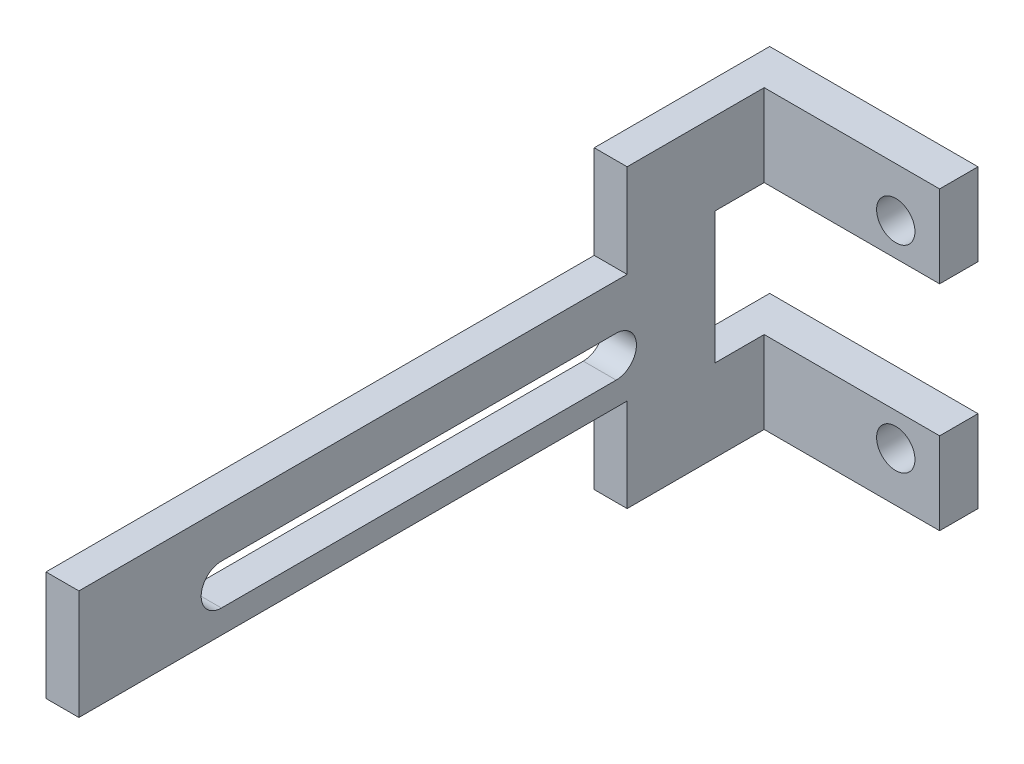
ISO-10303-21;
HEADER;
FILE_DESCRIPTION(('STEP AP214'),'2;1');
FILE_NAME('part.step','',(''),(''),'','','');
FILE_SCHEMA(('AUTOMOTIVE_DESIGN { 1 0 10303 214 1 1 1 1 }'));
ENDSEC;
DATA;
#1=APPLICATION_CONTEXT('core data for automotive mechanical design processes');
#2=APPLICATION_PROTOCOL_DEFINITION('international standard','automotive_design',2000,#1);
#3=PRODUCT_CONTEXT('',#1,'mechanical');
#4=PRODUCT('Part','Part','',(#3));
#5=PRODUCT_RELATED_PRODUCT_CATEGORY('part','',(#4));
#6=PRODUCT_DEFINITION_FORMATION('','',#4);
#7=PRODUCT_DEFINITION_CONTEXT('part definition',#1,'design');
#8=PRODUCT_DEFINITION('design','',#6,#7);
#9=PRODUCT_DEFINITION_SHAPE('','',#8);
#10=(LENGTH_UNIT() NAMED_UNIT(*) SI_UNIT(.MILLI.,.METRE.));
#11=(NAMED_UNIT(*) PLANE_ANGLE_UNIT() SI_UNIT($,.RADIAN.));
#12=(NAMED_UNIT(*) SI_UNIT($,.STERADIAN.) SOLID_ANGLE_UNIT());
#13=UNCERTAINTY_MEASURE_WITH_UNIT(LENGTH_MEASURE(1.E-05),#10,'distance_accuracy_value','');
#14=(GEOMETRIC_REPRESENTATION_CONTEXT(3) GLOBAL_UNCERTAINTY_ASSIGNED_CONTEXT((#13)) GLOBAL_UNIT_ASSIGNED_CONTEXT((#10,
#11,#12)) REPRESENTATION_CONTEXT('',''));
#15=CARTESIAN_POINT('',(0.,0.,0.));
#16=DIRECTION('',(0.,0.,1.));
#17=DIRECTION('',(1.,0.,0.));
#18=AXIS2_PLACEMENT_3D('',#15,#16,#17);
#19=CARTESIAN_POINT('',(3.,-13.5,0.));
#20=DIRECTION('',(0.,0.,1.));
#21=DIRECTION('',(1.,0.,0.));
#22=AXIS2_PLACEMENT_3D('',#19,#20,#21);
#23=PLANE('',#22);
#24=CARTESIAN_POINT('',(15.,-9.,0.));
#25=DIRECTION('',(0.,0.,1.));
#26=DIRECTION('',(1.,0.,0.));
#27=AXIS2_PLACEMENT_3D('',#24,#25,#26);
#28=CIRCLE('',#27,1.75);
#29=CARTESIAN_POINT('',(16.75,-9.,0.));
#30=VERTEX_POINT('',#29);
#31=EDGE_CURVE('E441',#30,#30,#28,.T.);
#32=ORIENTED_EDGE('',*,*,#31,.T.);
#33=EDGE_LOOP('',(#32));
#34=FACE_BOUND('',#33,.T.);
#35=DIRECTION('',(0.,1.,0.));
#36=VECTOR('',#35,1.);
#37=CARTESIAN_POINT('',(0.,-13.5,0.));
#38=LINE('',#37,#36);
#39=CARTESIAN_POINT('',(0.,-13.5,0.));
#40=VERTEX_POINT('',#39);
#41=CARTESIAN_POINT('',(0.,-6.,0.));
#42=VERTEX_POINT('',#41);
#43=EDGE_CURVE('E202',#40,#42,#38,.T.);
#44=ORIENTED_EDGE('',*,*,#43,.T.);
#45=DIRECTION('',(1.,0.,0.));
#46=VECTOR('',#45,1.);
#47=CARTESIAN_POINT('',(-2.00000000000001,-6.,0.));
#48=LINE('',#47,#46);
#49=CARTESIAN_POINT('',(19.,-6.,0.));
#50=VERTEX_POINT('',#49);
#51=EDGE_CURVE('E186',#42,#50,#48,.T.);
#52=ORIENTED_EDGE('',*,*,#51,.T.);
#53=DIRECTION('',(0.,1.,0.));
#54=VECTOR('',#53,1.);
#55=CARTESIAN_POINT('',(19.,-13.5,0.));
#56=LINE('',#55,#54);
#57=CARTESIAN_POINT('',(19.,-13.5,0.));
#58=VERTEX_POINT('',#57);
#59=EDGE_CURVE('E199',#58,#50,#56,.T.);
#60=ORIENTED_EDGE('',*,*,#59,.F.);
#61=DIRECTION('',(-1.,0.,0.));
#62=VECTOR('',#61,1.);
#63=CARTESIAN_POINT('',(3.,-13.5,0.));
#64=LINE('',#63,#62);
#65=EDGE_CURVE('E339',#58,#40,#64,.T.);
#66=ORIENTED_EDGE('',*,*,#65,.T.);
#67=EDGE_LOOP('',(#44,#52,#60,#66));
#68=FACE_BOUND('',#67,.T.);
#69=ADVANCED_FACE('F45',(#34,#68),#23,.F.);
#70=CARTESIAN_POINT('',(19.,-13.5,3.5));
#71=DIRECTION('',(0.,0.,-1.));
#72=DIRECTION('',(0.,1.,0.));
#73=AXIS2_PLACEMENT_3D('',#70,#71,#72);
#74=PLANE('',#73);
#75=CARTESIAN_POINT('',(15.,-9.,3.5));
#76=DIRECTION('',(0.,0.,1.));
#77=DIRECTION('',(1.,0.,0.));
#78=AXIS2_PLACEMENT_3D('',#75,#76,#77);
#79=CIRCLE('',#78,1.75);
#80=CARTESIAN_POINT('',(16.75,-9.,3.5));
#81=VERTEX_POINT('',#80);
#82=EDGE_CURVE('E450',#81,#81,#79,.T.);
#83=ORIENTED_EDGE('',*,*,#82,.F.);
#84=EDGE_LOOP('',(#83));
#85=FACE_BOUND('',#84,.T.);
#86=DIRECTION('',(0.,-1.,0.));
#87=VECTOR('',#86,1.);
#88=CARTESIAN_POINT('',(19.,-13.5,3.5));
#89=LINE('',#88,#87);
#90=CARTESIAN_POINT('',(19.,-6.,3.5));
#91=VERTEX_POINT('',#90);
#92=CARTESIAN_POINT('',(19.,-13.5,3.5));
#93=VERTEX_POINT('',#92);
#94=EDGE_CURVE('E216',#91,#93,#89,.T.);
#95=ORIENTED_EDGE('',*,*,#94,.F.);
#96=DIRECTION('',(-1.,0.,0.));
#97=VECTOR('',#96,1.);
#98=CARTESIAN_POINT('',(19.,-6.,3.5));
#99=LINE('',#98,#97);
#100=CARTESIAN_POINT('',(3.,-6.,3.5));
#101=VERTEX_POINT('',#100);
#102=EDGE_CURVE('E189',#91,#101,#99,.T.);
#103=ORIENTED_EDGE('',*,*,#102,.T.);
#104=DIRECTION('',(0.,-1.,0.));
#105=VECTOR('',#104,1.);
#106=CARTESIAN_POINT('',(3.,-13.5,3.5));
#107=LINE('',#106,#105);
#108=CARTESIAN_POINT('',(3.,-13.5,3.5));
#109=VERTEX_POINT('',#108);
#110=EDGE_CURVE('E228',#101,#109,#107,.T.);
#111=ORIENTED_EDGE('',*,*,#110,.T.);
#112=DIRECTION('',(-1.,0.,0.));
#113=VECTOR('',#112,1.);
#114=CARTESIAN_POINT('',(19.,-13.5,3.5));
#115=LINE('',#114,#113);
#116=EDGE_CURVE('E225',#93,#109,#115,.T.);
#117=ORIENTED_EDGE('',*,*,#116,.F.);
#118=EDGE_LOOP('',(#95,#103,#111,#117));
#119=FACE_BOUND('',#118,.T.);
#120=ADVANCED_FACE('F427',(#85,#119),#74,.F.);
#121=CARTESIAN_POINT('',(19.,0.,0.));
#122=DIRECTION('',(1.,0.,0.));
#123=DIRECTION('',(0.,0.,-1.));
#124=AXIS2_PLACEMENT_3D('',#121,#122,#123);
#125=PLANE('',#124);
#126=DIRECTION('',(0.,0.,-1.));
#127=VECTOR('',#126,1.);
#128=CARTESIAN_POINT('',(19.,-6.,0.));
#129=LINE('',#128,#127);
#130=EDGE_CURVE('E54',#91,#50,#129,.T.);
#131=ORIENTED_EDGE('',*,*,#130,.F.);
#132=ORIENTED_EDGE('',*,*,#94,.T.);
#133=DIRECTION('',(0.,0.,-1.));
#134=VECTOR('',#133,1.);
#135=CARTESIAN_POINT('',(19.,-13.5,3.5));
#136=LINE('',#135,#134);
#137=EDGE_CURVE('E208',#93,#58,#136,.T.);
#138=ORIENTED_EDGE('',*,*,#137,.T.);
#139=ORIENTED_EDGE('',*,*,#59,.T.);
#140=EDGE_LOOP('',(#131,#132,#138,#139));
#141=FACE_BOUND('',#140,.T.);
#142=ADVANCED_FACE('F206',(#141),#125,.T.);
#143=CARTESIAN_POINT('',(3.,0.,0.));
#144=DIRECTION('',(1.,0.,0.));
#145=DIRECTION('',(0.,0.,-1.));
#146=AXIS2_PLACEMENT_3D('',#143,#144,#145);
#147=PLANE('',#146);
#148=DIRECTION('',(0.,0.,-1.));
#149=VECTOR('',#148,1.);
#150=CARTESIAN_POINT('',(3.,-6.,0.));
#151=LINE('',#150,#149);
#152=CARTESIAN_POINT('',(3.,-6.,8.));
#153=VERTEX_POINT('',#152);
#154=EDGE_CURVE('E463',#153,#101,#151,.T.);
#155=ORIENTED_EDGE('',*,*,#154,.F.);
#156=DIRECTION('',(0.,-1.,0.));
#157=VECTOR('',#156,1.);
#158=CARTESIAN_POINT('',(3.,0.,8.));
#159=LINE('',#158,#157);
#160=CARTESIAN_POINT('',(3.,6.,8.));
#161=VERTEX_POINT('',#160);
#162=EDGE_CURVE('E455',#161,#153,#159,.T.);
#163=ORIENTED_EDGE('',*,*,#162,.F.);
#164=DIRECTION('',(0.,0.,1.));
#165=VECTOR('',#164,1.);
#166=CARTESIAN_POINT('',(3.,6.,0.));
#167=LINE('',#166,#165);
#168=CARTESIAN_POINT('',(3.,6.,3.5));
#169=VERTEX_POINT('',#168);
#170=EDGE_CURVE('E473',#169,#161,#167,.T.);
#171=ORIENTED_EDGE('',*,*,#170,.F.);
#172=CARTESIAN_POINT('',(3.,13.5,3.5));
#173=VERTEX_POINT('',#172);
#174=EDGE_CURVE('E69',#173,#169,#107,.T.);
#175=ORIENTED_EDGE('',*,*,#174,.F.);
#176=DIRECTION('',(0.,0.,1.));
#177=VECTOR('',#176,1.);
#178=CARTESIAN_POINT('',(3.,13.5,16.));
#179=LINE('',#178,#177);
#180=CARTESIAN_POINT('',(3.,13.5,16.));
#181=VERTEX_POINT('',#180);
#182=EDGE_CURVE('E298',#173,#181,#179,.T.);
#183=ORIENTED_EDGE('',*,*,#182,.T.);
#184=DIRECTION('',(0.,-1.,0.));
#185=VECTOR('',#184,1.);
#186=CARTESIAN_POINT('',(3.,5.,16.));
#187=LINE('',#186,#185);
#188=CARTESIAN_POINT('',(3.,5.,16.));
#189=VERTEX_POINT('',#188);
#190=EDGE_CURVE('E301',#181,#189,#187,.T.);
#191=ORIENTED_EDGE('',*,*,#190,.T.);
#192=DIRECTION('',(0.,0.,1.));
#193=VECTOR('',#192,1.);
#194=CARTESIAN_POINT('',(3.,4.99999999999999,66.));
#195=LINE('',#194,#193);
#196=CARTESIAN_POINT('',(3.,4.99999999999999,66.));
#197=VERTEX_POINT('',#196);
#198=EDGE_CURVE('E280',#189,#197,#195,.T.);
#199=ORIENTED_EDGE('',*,*,#198,.T.);
#200=DIRECTION('',(0.,-1.,0.));
#201=VECTOR('',#200,1.);
#202=CARTESIAN_POINT('',(3.,-5.,66.));
#203=LINE('',#202,#201);
#204=CARTESIAN_POINT('',(3.,-5.,66.));
#205=VERTEX_POINT('',#204);
#206=EDGE_CURVE('E284',#197,#205,#203,.T.);
#207=ORIENTED_EDGE('',*,*,#206,.T.);
#208=DIRECTION('',(0.,0.,-1.));
#209=VECTOR('',#208,1.);
#210=CARTESIAN_POINT('',(3.,-5.,66.));
#211=LINE('',#210,#209);
#212=CARTESIAN_POINT('',(3.,-5.,16.));
#213=VERTEX_POINT('',#212);
#214=EDGE_CURVE('E288',#205,#213,#211,.T.);
#215=ORIENTED_EDGE('',*,*,#214,.T.);
#216=DIRECTION('',(0.,-1.,0.));
#217=VECTOR('',#216,1.);
#218=CARTESIAN_POINT('',(3.,-13.5,16.));
#219=LINE('',#218,#217);
#220=CARTESIAN_POINT('',(3.,-13.5,16.));
#221=VERTEX_POINT('',#220);
#222=EDGE_CURVE('E291',#213,#221,#219,.T.);
#223=ORIENTED_EDGE('',*,*,#222,.T.);
#224=DIRECTION('',(0.,0.,-1.));
#225=VECTOR('',#224,1.);
#226=CARTESIAN_POINT('',(3.,-13.5,16.));
#227=LINE('',#226,#225);
#228=EDGE_CURVE('E294',#221,#109,#227,.T.);
#229=ORIENTED_EDGE('',*,*,#228,.T.);
#230=ORIENTED_EDGE('',*,*,#110,.F.);
#231=EDGE_LOOP('',(#155,#163,#171,#175,#183,#191,#199,#207,#215,#223,#229,#230));
#232=FACE_BOUND('',#231,.T.);
#233=DIRECTION('',(0.,0.,-1.));
#234=VECTOR('',#233,1.);
#235=CARTESIAN_POINT('',(3.,-2.85000000000001,53.));
#236=LINE('',#235,#234);
#237=CARTESIAN_POINT('',(3.,-2.85000000000001,53.));
#238=VERTEX_POINT('',#237);
#239=CARTESIAN_POINT('',(3.,-2.85,17.));
#240=VERTEX_POINT('',#239);
#241=EDGE_CURVE('E240',#238,#240,#236,.T.);
#242=ORIENTED_EDGE('',*,*,#241,.F.);
#243=CARTESIAN_POINT('',(3.,-1.00000000000001,53.));
#244=DIRECTION('',(1.,0.,0.));
#245=DIRECTION('',(0.,0.,-1.));
#246=AXIS2_PLACEMENT_3D('',#243,#244,#245);
#247=CIRCLE('',#246,1.85);
#248=CARTESIAN_POINT('',(3.,0.849999999999994,53.));
#249=VERTEX_POINT('',#248);
#250=EDGE_CURVE('E237',#249,#238,#247,.T.);
#251=ORIENTED_EDGE('',*,*,#250,.F.);
#252=DIRECTION('',(0.,0.,1.));
#253=VECTOR('',#252,1.);
#254=CARTESIAN_POINT('',(3.,0.849999999999994,53.));
#255=LINE('',#254,#253);
#256=CARTESIAN_POINT('',(3.,0.849999999999998,17.));
#257=VERTEX_POINT('',#256);
#258=EDGE_CURVE('E248',#257,#249,#255,.T.);
#259=ORIENTED_EDGE('',*,*,#258,.F.);
#260=CARTESIAN_POINT('',(3.,-1.,17.));
#261=DIRECTION('',(1.,0.,0.));
#262=DIRECTION('',(0.,0.,-1.));
#263=AXIS2_PLACEMENT_3D('',#260,#261,#262);
#264=CIRCLE('',#263,1.85);
#265=EDGE_CURVE('E244',#240,#257,#264,.T.);
#266=ORIENTED_EDGE('',*,*,#265,.F.);
#267=EDGE_LOOP('',(#242,#251,#259,#266));
#268=FACE_BOUND('',#267,.T.);
#269=ADVANCED_FACE('F383',(#232,#268),#147,.T.);
#270=CARTESIAN_POINT('',(0.,0.,0.));
#271=DIRECTION('',(1.,0.,0.));
#272=DIRECTION('',(0.,0.,-1.));
#273=AXIS2_PLACEMENT_3D('',#270,#271,#272);
#274=PLANE('',#273);
#275=DIRECTION('',(0.,-1.,0.));
#276=VECTOR('',#275,1.);
#277=CARTESIAN_POINT('',(0.,0.,8.));
#278=LINE('',#277,#276);
#279=CARTESIAN_POINT('',(0.,6.,8.));
#280=VERTEX_POINT('',#279);
#281=CARTESIAN_POINT('',(0.,-6.,8.));
#282=VERTEX_POINT('',#281);
#283=EDGE_CURVE('E11',#280,#282,#278,.T.);
#284=ORIENTED_EDGE('',*,*,#283,.T.);
#285=DIRECTION('',(0.,0.,-1.));
#286=VECTOR('',#285,1.);
#287=CARTESIAN_POINT('',(0.,-6.,0.));
#288=LINE('',#287,#286);
#289=EDGE_CURVE('E459',#282,#42,#288,.T.);
#290=ORIENTED_EDGE('',*,*,#289,.T.);
#291=ORIENTED_EDGE('',*,*,#43,.F.);
#292=DIRECTION('',(0.,0.,-1.));
#293=VECTOR('',#292,1.);
#294=CARTESIAN_POINT('',(0.,-13.5,16.));
#295=LINE('',#294,#293);
#296=CARTESIAN_POINT('',(0.,-13.5,16.));
#297=VERTEX_POINT('',#296);
#298=EDGE_CURVE('E317',#297,#40,#295,.T.);
#299=ORIENTED_EDGE('',*,*,#298,.F.);
#300=DIRECTION('',(0.,-1.,0.));
#301=VECTOR('',#300,1.);
#302=CARTESIAN_POINT('',(0.,-13.5,16.));
#303=LINE('',#302,#301);
#304=CARTESIAN_POINT('',(0.,-5.,16.));
#305=VERTEX_POINT('',#304);
#306=EDGE_CURVE('E314',#305,#297,#303,.T.);
#307=ORIENTED_EDGE('',*,*,#306,.F.);
#308=DIRECTION('',(0.,0.,-1.));
#309=VECTOR('',#308,1.);
#310=CARTESIAN_POINT('',(0.,-5.,66.));
#311=LINE('',#310,#309);
#312=CARTESIAN_POINT('',(0.,-5.,66.));
#313=VERTEX_POINT('',#312);
#314=EDGE_CURVE('E311',#313,#305,#311,.T.);
#315=ORIENTED_EDGE('',*,*,#314,.F.);
#316=DIRECTION('',(0.,-1.,0.));
#317=VECTOR('',#316,1.);
#318=CARTESIAN_POINT('',(0.,-5.,66.));
#319=LINE('',#318,#317);
#320=CARTESIAN_POINT('',(0.,4.99999999999999,66.));
#321=VERTEX_POINT('',#320);
#322=EDGE_CURVE('E308',#321,#313,#319,.T.);
#323=ORIENTED_EDGE('',*,*,#322,.F.);
#324=DIRECTION('',(0.,0.,1.));
#325=VECTOR('',#324,1.);
#326=CARTESIAN_POINT('',(0.,4.99999999999999,66.));
#327=LINE('',#326,#325);
#328=CARTESIAN_POINT('',(0.,5.,16.));
#329=VERTEX_POINT('',#328);
#330=EDGE_CURVE('E279',#329,#321,#327,.T.);
#331=ORIENTED_EDGE('',*,*,#330,.F.);
#332=DIRECTION('',(0.,-1.,0.));
#333=VECTOR('',#332,1.);
#334=CARTESIAN_POINT('',(0.,5.,16.));
#335=LINE('',#334,#333);
#336=CARTESIAN_POINT('',(0.,13.5,16.));
#337=VERTEX_POINT('',#336);
#338=EDGE_CURVE('E285',#337,#329,#335,.T.);
#339=ORIENTED_EDGE('',*,*,#338,.F.);
#340=DIRECTION('',(0.,0.,1.));
#341=VECTOR('',#340,1.);
#342=CARTESIAN_POINT('',(0.,13.5,16.));
#343=LINE('',#342,#341);
#344=CARTESIAN_POINT('',(0.,13.5,0.));
#345=VERTEX_POINT('',#344);
#346=EDGE_CURVE('E323',#345,#337,#343,.T.);
#347=ORIENTED_EDGE('',*,*,#346,.F.);
#348=CARTESIAN_POINT('',(0.,6.,0.));
#349=VERTEX_POINT('',#348);
#350=EDGE_CURVE('E320',#349,#345,#38,.T.);
#351=ORIENTED_EDGE('',*,*,#350,.F.);
#352=DIRECTION('',(0.,0.,1.));
#353=VECTOR('',#352,1.);
#354=CARTESIAN_POINT('',(0.,6.,0.));
#355=LINE('',#354,#353);
#356=EDGE_CURVE('E397',#349,#280,#355,.T.);
#357=ORIENTED_EDGE('',*,*,#356,.T.);
#358=EDGE_LOOP('',(#284,#290,#291,#299,#307,#315,#323,#331,#339,#347,#351,#357));
#359=FACE_BOUND('',#358,.T.);
#360=CARTESIAN_POINT('',(0.,-1.00000000000001,53.));
#361=DIRECTION('',(1.,0.,0.));
#362=DIRECTION('',(0.,0.,-1.));
#363=AXIS2_PLACEMENT_3D('',#360,#361,#362);
#364=CIRCLE('',#363,1.85);
#365=CARTESIAN_POINT('',(0.,0.849999999999994,53.));
#366=VERTEX_POINT('',#365);
#367=CARTESIAN_POINT('',(0.,-2.85000000000001,53.));
#368=VERTEX_POINT('',#367);
#369=EDGE_CURVE('E236',#366,#368,#364,.T.);
#370=ORIENTED_EDGE('',*,*,#369,.T.);
#371=DIRECTION('',(0.,0.,-1.));
#372=VECTOR('',#371,1.);
#373=CARTESIAN_POINT('',(0.,-2.85000000000001,53.));
#374=LINE('',#373,#372);
#375=CARTESIAN_POINT('',(0.,-2.85,17.));
#376=VERTEX_POINT('',#375);
#377=EDGE_CURVE('E255',#368,#376,#374,.T.);
#378=ORIENTED_EDGE('',*,*,#377,.T.);
#379=CARTESIAN_POINT('',(0.,-1.,17.));
#380=DIRECTION('',(1.,0.,0.));
#381=DIRECTION('',(0.,0.,-1.));
#382=AXIS2_PLACEMENT_3D('',#379,#380,#381);
#383=CIRCLE('',#382,1.85);
#384=CARTESIAN_POINT('',(0.,0.849999999999998,17.));
#385=VERTEX_POINT('',#384);
#386=EDGE_CURVE('E259',#376,#385,#383,.T.);
#387=ORIENTED_EDGE('',*,*,#386,.T.);
#388=DIRECTION('',(0.,0.,1.));
#389=VECTOR('',#388,1.);
#390=CARTESIAN_POINT('',(0.,0.849999999999994,53.));
#391=LINE('',#390,#389);
#392=EDGE_CURVE('E241',#385,#366,#391,.T.);
#393=ORIENTED_EDGE('',*,*,#392,.T.);
#394=EDGE_LOOP('',(#370,#378,#387,#393));
#395=FACE_BOUND('',#394,.T.);
#396=ADVANCED_FACE('F367',(#359,#395),#274,.F.);
#397=CARTESIAN_POINT('',(3.,4.99999999999999,66.));
#398=DIRECTION('',(0.,-1.,0.));
#399=DIRECTION('',(0.,0.,-1.));
#400=AXIS2_PLACEMENT_3D('',#397,#398,#399);
#401=PLANE('',#400);
#402=ORIENTED_EDGE('',*,*,#330,.T.);
#403=DIRECTION('',(-1.,0.,0.));
#404=VECTOR('',#403,1.);
#405=CARTESIAN_POINT('',(3.,4.99999999999999,66.));
#406=LINE('',#405,#404);
#407=EDGE_CURVE('E194',#197,#321,#406,.T.);
#408=ORIENTED_EDGE('',*,*,#407,.F.);
#409=ORIENTED_EDGE('',*,*,#198,.F.);
#410=DIRECTION('',(-1.,0.,0.));
#411=VECTOR('',#410,1.);
#412=CARTESIAN_POINT('',(3.,5.,16.));
#413=LINE('',#412,#411);
#414=EDGE_CURVE('E304',#189,#329,#413,.T.);
#415=ORIENTED_EDGE('',*,*,#414,.T.);
#416=EDGE_LOOP('',(#402,#408,#409,#415));
#417=FACE_BOUND('',#416,.T.);
#418=ADVANCED_FACE('F47',(#417),#401,.F.);
#419=CARTESIAN_POINT('',(3.,-5.,66.));
#420=DIRECTION('',(0.,0.,-1.));
#421=DIRECTION('',(-1.,0.,0.));
#422=AXIS2_PLACEMENT_3D('',#419,#420,#421);
#423=PLANE('',#422);
#424=ORIENTED_EDGE('',*,*,#322,.T.);
#425=DIRECTION('',(-1.,0.,0.));
#426=VECTOR('',#425,1.);
#427=CARTESIAN_POINT('',(3.,-5.,66.));
#428=LINE('',#427,#426);
#429=EDGE_CURVE('E350',#205,#313,#428,.T.);
#430=ORIENTED_EDGE('',*,*,#429,.F.);
#431=ORIENTED_EDGE('',*,*,#206,.F.);
#432=ORIENTED_EDGE('',*,*,#407,.T.);
#433=EDGE_LOOP('',(#424,#430,#431,#432));
#434=FACE_BOUND('',#433,.T.);
#435=ADVANCED_FACE('F359',(#434),#423,.F.);
#436=CARTESIAN_POINT('',(3.,-5.,66.));
#437=DIRECTION('',(0.,1.,0.));
#438=DIRECTION('',(0.,0.,1.));
#439=AXIS2_PLACEMENT_3D('',#436,#437,#438);
#440=PLANE('',#439);
#441=ORIENTED_EDGE('',*,*,#314,.T.);
#442=DIRECTION('',(-1.,0.,0.));
#443=VECTOR('',#442,1.);
#444=CARTESIAN_POINT('',(3.,-5.,16.));
#445=LINE('',#444,#443);
#446=EDGE_CURVE('E346',#213,#305,#445,.T.);
#447=ORIENTED_EDGE('',*,*,#446,.F.);
#448=ORIENTED_EDGE('',*,*,#214,.F.);
#449=ORIENTED_EDGE('',*,*,#429,.T.);
#450=EDGE_LOOP('',(#441,#447,#448,#449));
#451=FACE_BOUND('',#450,.T.);
#452=ADVANCED_FACE('F375',(#451),#440,.F.);
#453=CARTESIAN_POINT('',(3.,-13.5,16.));
#454=DIRECTION('',(0.,0.,-1.));
#455=DIRECTION('',(-1.,0.,0.));
#456=AXIS2_PLACEMENT_3D('',#453,#454,#455);
#457=PLANE('',#456);
#458=ORIENTED_EDGE('',*,*,#306,.T.);
#459=DIRECTION('',(-1.,0.,0.));
#460=VECTOR('',#459,1.);
#461=CARTESIAN_POINT('',(3.,-13.5,16.));
#462=LINE('',#461,#460);
#463=EDGE_CURVE('E342',#221,#297,#462,.T.);
#464=ORIENTED_EDGE('',*,*,#463,.F.);
#465=ORIENTED_EDGE('',*,*,#222,.F.);
#466=ORIENTED_EDGE('',*,*,#446,.T.);
#467=EDGE_LOOP('',(#458,#464,#465,#466));
#468=FACE_BOUND('',#467,.T.);
#469=ADVANCED_FACE('F379',(#468),#457,.F.);
#470=CARTESIAN_POINT('',(3.,-13.5,16.));
#471=DIRECTION('',(0.,1.,0.));
#472=DIRECTION('',(0.,0.,1.));
#473=AXIS2_PLACEMENT_3D('',#470,#471,#472);
#474=PLANE('',#473);
#475=ORIENTED_EDGE('',*,*,#298,.T.);
#476=ORIENTED_EDGE('',*,*,#65,.F.);
#477=ORIENTED_EDGE('',*,*,#137,.F.);
#478=ORIENTED_EDGE('',*,*,#116,.T.);
#479=ORIENTED_EDGE('',*,*,#228,.F.);
#480=ORIENTED_EDGE('',*,*,#463,.T.);
#481=EDGE_LOOP('',(#475,#476,#477,#478,#479,#480));
#482=FACE_BOUND('',#481,.T.);
#483=ADVANCED_FACE('F429',(#482),#474,.F.);
#484=CARTESIAN_POINT('',(15.,9.,0.));
#485=DIRECTION('',(0.,0.,1.));
#486=DIRECTION('',(1.,0.,0.));
#487=AXIS2_PLACEMENT_3D('',#484,#485,#486);
#488=CIRCLE('',#487,1.75);
#489=CARTESIAN_POINT('',(16.75,9.,0.));
#490=VERTEX_POINT('',#489);
#491=EDGE_CURVE('E437',#490,#490,#488,.T.);
#492=ORIENTED_EDGE('',*,*,#491,.T.);
#493=EDGE_LOOP('',(#492));
#494=FACE_BOUND('',#493,.T.);
#495=CARTESIAN_POINT('',(19.,6.,0.));
#496=VERTEX_POINT('',#495);
#497=CARTESIAN_POINT('',(19.,13.5,0.));
#498=VERTEX_POINT('',#497);
#499=EDGE_CURVE('E211',#496,#498,#56,.T.);
#500=ORIENTED_EDGE('',*,*,#499,.F.);
#501=DIRECTION('',(1.,0.,0.));
#502=VECTOR('',#501,1.);
#503=CARTESIAN_POINT('',(-2.00000000000001,6.,0.));
#504=LINE('',#503,#502);
#505=EDGE_CURVE('E61',#349,#496,#504,.T.);
#506=ORIENTED_EDGE('',*,*,#505,.F.);
#507=ORIENTED_EDGE('',*,*,#350,.T.);
#508=DIRECTION('',(-1.,0.,0.));
#509=VECTOR('',#508,1.);
#510=CARTESIAN_POINT('',(3.,13.5,0.));
#511=LINE('',#510,#509);
#512=EDGE_CURVE('E335',#498,#345,#511,.T.);
#513=ORIENTED_EDGE('',*,*,#512,.F.);
#514=EDGE_LOOP('',(#500,#506,#507,#513));
#515=FACE_BOUND('',#514,.T.);
#516=ADVANCED_FACE('F505',(#494,#515),#23,.F.);
#517=CARTESIAN_POINT('',(3.,13.5,16.));
#518=DIRECTION('',(0.,-1.,0.));
#519=DIRECTION('',(0.,0.,-1.));
#520=AXIS2_PLACEMENT_3D('',#517,#518,#519);
#521=PLANE('',#520);
#522=ORIENTED_EDGE('',*,*,#346,.T.);
#523=DIRECTION('',(-1.,0.,0.));
#524=VECTOR('',#523,1.);
#525=CARTESIAN_POINT('',(3.,13.5,16.));
#526=LINE('',#525,#524);
#527=EDGE_CURVE('E331',#181,#337,#526,.T.);
#528=ORIENTED_EDGE('',*,*,#527,.F.);
#529=ORIENTED_EDGE('',*,*,#182,.F.);
#530=DIRECTION('',(-1.,0.,0.));
#531=VECTOR('',#530,1.);
#532=CARTESIAN_POINT('',(19.,13.5,3.5));
#533=LINE('',#532,#531);
#534=CARTESIAN_POINT('',(19.,13.5,3.5));
#535=VERTEX_POINT('',#534);
#536=EDGE_CURVE('E232',#535,#173,#533,.T.);
#537=ORIENTED_EDGE('',*,*,#536,.F.);
#538=DIRECTION('',(0.,0.,1.));
#539=VECTOR('',#538,1.);
#540=CARTESIAN_POINT('',(19.,13.5,3.5));
#541=LINE('',#540,#539);
#542=EDGE_CURVE('E210',#498,#535,#541,.T.);
#543=ORIENTED_EDGE('',*,*,#542,.F.);
#544=ORIENTED_EDGE('',*,*,#512,.T.);
#545=EDGE_LOOP('',(#522,#528,#529,#537,#543,#544));
#546=FACE_BOUND('',#545,.T.);
#547=ADVANCED_FACE('F391',(#546),#521,.F.);
#548=CARTESIAN_POINT('',(3.,5.,16.));
#549=DIRECTION('',(0.,0.,-1.));
#550=DIRECTION('',(-1.,0.,0.));
#551=AXIS2_PLACEMENT_3D('',#548,#549,#550);
#552=PLANE('',#551);
#553=ORIENTED_EDGE('',*,*,#338,.T.);
#554=ORIENTED_EDGE('',*,*,#414,.F.);
#555=ORIENTED_EDGE('',*,*,#190,.F.);
#556=ORIENTED_EDGE('',*,*,#527,.T.);
#557=EDGE_LOOP('',(#553,#554,#555,#556));
#558=FACE_BOUND('',#557,.T.);
#559=ADVANCED_FACE('F389',(#558),#552,.F.);
#560=CARTESIAN_POINT('',(3.,-1.00000000000001,53.));
#561=DIRECTION('',(-1.,0.,0.));
#562=DIRECTION('',(0.,0.,1.));
#563=AXIS2_PLACEMENT_3D('',#560,#561,#562);
#564=CYLINDRICAL_SURFACE('',#563,1.85);
#565=ORIENTED_EDGE('',*,*,#369,.F.);
#566=DIRECTION('',(-1.,0.,0.));
#567=VECTOR('',#566,1.);
#568=CARTESIAN_POINT('',(3.,0.849999999999994,53.));
#569=LINE('',#568,#567);
#570=EDGE_CURVE('E251',#249,#366,#569,.T.);
#571=ORIENTED_EDGE('',*,*,#570,.F.);
#572=ORIENTED_EDGE('',*,*,#250,.T.);
#573=DIRECTION('',(-1.,0.,0.));
#574=VECTOR('',#573,1.);
#575=CARTESIAN_POINT('',(3.,-2.85000000000001,53.));
#576=LINE('',#575,#574);
#577=EDGE_CURVE('E275',#238,#368,#576,.T.);
#578=ORIENTED_EDGE('',*,*,#577,.T.);
#579=EDGE_LOOP('',(#565,#571,#572,#578));
#580=FACE_BOUND('',#579,.T.);
#581=ADVANCED_FACE('F553',(#580),#564,.F.);
#582=CARTESIAN_POINT('',(3.,-2.85000000000001,53.));
#583=DIRECTION('',(0.,1.,0.));
#584=DIRECTION('',(0.,0.,1.));
#585=AXIS2_PLACEMENT_3D('',#582,#583,#584);
#586=PLANE('',#585);
#587=ORIENTED_EDGE('',*,*,#377,.F.);
#588=ORIENTED_EDGE('',*,*,#577,.F.);
#589=ORIENTED_EDGE('',*,*,#241,.T.);
#590=DIRECTION('',(-1.,0.,0.));
#591=VECTOR('',#590,1.);
#592=CARTESIAN_POINT('',(3.,-2.85,17.));
#593=LINE('',#592,#591);
#594=EDGE_CURVE('E272',#240,#376,#593,.T.);
#595=ORIENTED_EDGE('',*,*,#594,.T.);
#596=EDGE_LOOP('',(#587,#588,#589,#595));
#597=FACE_BOUND('',#596,.T.);
#598=ADVANCED_FACE('F549',(#597),#586,.T.);
#599=CARTESIAN_POINT('',(3.,-1.,17.));
#600=DIRECTION('',(-1.,0.,0.));
#601=DIRECTION('',(0.,0.,1.));
#602=AXIS2_PLACEMENT_3D('',#599,#600,#601);
#603=CYLINDRICAL_SURFACE('',#602,1.85);
#604=ORIENTED_EDGE('',*,*,#386,.F.);
#605=ORIENTED_EDGE('',*,*,#594,.F.);
#606=ORIENTED_EDGE('',*,*,#265,.T.);
#607=DIRECTION('',(-1.,0.,0.));
#608=VECTOR('',#607,1.);
#609=CARTESIAN_POINT('',(3.,0.849999999999998,17.));
#610=LINE('',#609,#608);
#611=EDGE_CURVE('E269',#257,#385,#610,.T.);
#612=ORIENTED_EDGE('',*,*,#611,.T.);
#613=EDGE_LOOP('',(#604,#605,#606,#612));
#614=FACE_BOUND('',#613,.T.);
#615=ADVANCED_FACE('F545',(#614),#603,.F.);
#616=CARTESIAN_POINT('',(3.,0.849999999999994,53.));
#617=DIRECTION('',(0.,-1.,0.));
#618=DIRECTION('',(0.,0.,-1.));
#619=AXIS2_PLACEMENT_3D('',#616,#617,#618);
#620=PLANE('',#619);
#621=ORIENTED_EDGE('',*,*,#392,.F.);
#622=ORIENTED_EDGE('',*,*,#611,.F.);
#623=ORIENTED_EDGE('',*,*,#258,.T.);
#624=ORIENTED_EDGE('',*,*,#570,.T.);
#625=EDGE_LOOP('',(#621,#622,#623,#624));
#626=FACE_BOUND('',#625,.T.);
#627=ADVANCED_FACE('F541',(#626),#620,.T.);
#628=CARTESIAN_POINT('',(15.,9.,3.5));
#629=DIRECTION('',(0.,0.,1.));
#630=DIRECTION('',(1.,0.,0.));
#631=AXIS2_PLACEMENT_3D('',#628,#629,#630);
#632=CIRCLE('',#631,1.75);
#633=CARTESIAN_POINT('',(16.75,9.,3.5));
#634=VERTEX_POINT('',#633);
#635=EDGE_CURVE('E445',#634,#634,#632,.T.);
#636=ORIENTED_EDGE('',*,*,#635,.F.);
#637=EDGE_LOOP('',(#636));
#638=FACE_BOUND('',#637,.T.);
#639=ORIENTED_EDGE('',*,*,#174,.T.);
#640=DIRECTION('',(1.,0.,0.));
#641=VECTOR('',#640,1.);
#642=CARTESIAN_POINT('',(19.,6.,3.5));
#643=LINE('',#642,#641);
#644=CARTESIAN_POINT('',(19.,6.,3.5));
#645=VERTEX_POINT('',#644);
#646=EDGE_CURVE('E477',#169,#645,#643,.T.);
#647=ORIENTED_EDGE('',*,*,#646,.T.);
#648=EDGE_CURVE('E221',#535,#645,#89,.T.);
#649=ORIENTED_EDGE('',*,*,#648,.F.);
#650=ORIENTED_EDGE('',*,*,#536,.T.);
#651=EDGE_LOOP('',(#639,#647,#649,#650));
#652=FACE_BOUND('',#651,.T.);
#653=ADVANCED_FACE('F503',(#638,#652),#74,.F.);
#654=DIRECTION('',(0.,0.,1.));
#655=VECTOR('',#654,1.);
#656=CARTESIAN_POINT('',(19.,6.,0.));
#657=LINE('',#656,#655);
#658=EDGE_CURVE('E204',#496,#645,#657,.T.);
#659=ORIENTED_EDGE('',*,*,#658,.F.);
#660=ORIENTED_EDGE('',*,*,#499,.T.);
#661=ORIENTED_EDGE('',*,*,#542,.T.);
#662=ORIENTED_EDGE('',*,*,#648,.T.);
#663=EDGE_LOOP('',(#659,#660,#661,#662));
#664=FACE_BOUND('',#663,.T.);
#665=ADVANCED_FACE('F504',(#664),#125,.T.);
#666=CARTESIAN_POINT('',(15.,-9.,-6.5));
#667=DIRECTION('',(0.,0.,1.));
#668=DIRECTION('',(1.,0.,0.));
#669=AXIS2_PLACEMENT_3D('',#666,#667,#668);
#670=CYLINDRICAL_SURFACE('',#669,1.75);
#671=ORIENTED_EDGE('',*,*,#82,.T.);
#672=EDGE_LOOP('',(#671));
#673=FACE_BOUND('',#672,.T.);
#674=ORIENTED_EDGE('',*,*,#31,.F.);
#675=EDGE_LOOP('',(#674));
#676=FACE_BOUND('',#675,.T.);
#677=ADVANCED_FACE('F527',(#673,#676),#670,.F.);
#678=CARTESIAN_POINT('',(15.,9.,-6.5));
#679=DIRECTION('',(0.,0.,1.));
#680=DIRECTION('',(1.,0.,0.));
#681=AXIS2_PLACEMENT_3D('',#678,#679,#680);
#682=CYLINDRICAL_SURFACE('',#681,1.75);
#683=ORIENTED_EDGE('',*,*,#635,.T.);
#684=EDGE_LOOP('',(#683));
#685=FACE_BOUND('',#684,.T.);
#686=ORIENTED_EDGE('',*,*,#491,.F.);
#687=EDGE_LOOP('',(#686));
#688=FACE_BOUND('',#687,.T.);
#689=ADVANCED_FACE('F529',(#685,#688),#682,.F.);
#690=CARTESIAN_POINT('',(-2.00000000000001,-6.,8.));
#691=DIRECTION('',(0.,0.,1.));
#692=DIRECTION('',(1.,0.,0.));
#693=AXIS2_PLACEMENT_3D('',#690,#691,#692);
#694=PLANE('',#693);
#695=ORIENTED_EDGE('',*,*,#162,.T.);
#696=DIRECTION('',(1.,0.,0.));
#697=VECTOR('',#696,1.);
#698=CARTESIAN_POINT('',(-2.00000000000001,-6.,8.));
#699=LINE('',#698,#697);
#700=EDGE_CURVE('E482',#282,#153,#699,.T.);
#701=ORIENTED_EDGE('',*,*,#700,.F.);
#702=ORIENTED_EDGE('',*,*,#283,.F.);
#703=DIRECTION('',(1.,0.,0.));
#704=VECTOR('',#703,1.);
#705=CARTESIAN_POINT('',(-2.00000000000001,6.,8.));
#706=LINE('',#705,#704);
#707=EDGE_CURVE('E486',#280,#161,#706,.T.);
#708=ORIENTED_EDGE('',*,*,#707,.T.);
#709=EDGE_LOOP('',(#695,#701,#702,#708));
#710=FACE_BOUND('',#709,.T.);
#711=ADVANCED_FACE('F534',(#710),#694,.F.);
#712=CARTESIAN_POINT('',(-2.00000000000001,-6.,0.));
#713=DIRECTION('',(0.,-1.,0.));
#714=DIRECTION('',(0.,0.,-1.));
#715=AXIS2_PLACEMENT_3D('',#712,#713,#714);
#716=PLANE('',#715);
#717=ORIENTED_EDGE('',*,*,#700,.T.);
#718=ORIENTED_EDGE('',*,*,#154,.T.);
#719=ORIENTED_EDGE('',*,*,#102,.F.);
#720=ORIENTED_EDGE('',*,*,#130,.T.);
#721=ORIENTED_EDGE('',*,*,#51,.F.);
#722=ORIENTED_EDGE('',*,*,#289,.F.);
#723=EDGE_LOOP('',(#717,#718,#719,#720,#721,#722));
#724=FACE_BOUND('',#723,.T.);
#725=ADVANCED_FACE('F185',(#724),#716,.F.);
#726=CARTESIAN_POINT('',(-2.00000000000001,6.,0.));
#727=DIRECTION('',(0.,1.,0.));
#728=DIRECTION('',(0.,0.,1.));
#729=AXIS2_PLACEMENT_3D('',#726,#727,#728);
#730=PLANE('',#729);
#731=ORIENTED_EDGE('',*,*,#505,.T.);
#732=ORIENTED_EDGE('',*,*,#658,.T.);
#733=ORIENTED_EDGE('',*,*,#646,.F.);
#734=ORIENTED_EDGE('',*,*,#170,.T.);
#735=ORIENTED_EDGE('',*,*,#707,.F.);
#736=ORIENTED_EDGE('',*,*,#356,.F.);
#737=EDGE_LOOP('',(#731,#732,#733,#734,#735,#736));
#738=FACE_BOUND('',#737,.T.);
#739=ADVANCED_FACE('F498',(#738),#730,.F.);
#740=CLOSED_SHELL('',(#69,#120,#142,#269,#396,#418,#435,#452,#469,#483,#516,#547,#559,#581,#598,
#615,#627,#653,#665,#677,#689,#711,#725,#739));
#741=MANIFOLD_SOLID_BREP('B2',#740);
#742=ADVANCED_BREP_SHAPE_REPRESENTATION('',(#18,#741),#14);
#743=SHAPE_DEFINITION_REPRESENTATION(#9,#742);
ENDSEC;
END-ISO-10303-21;
